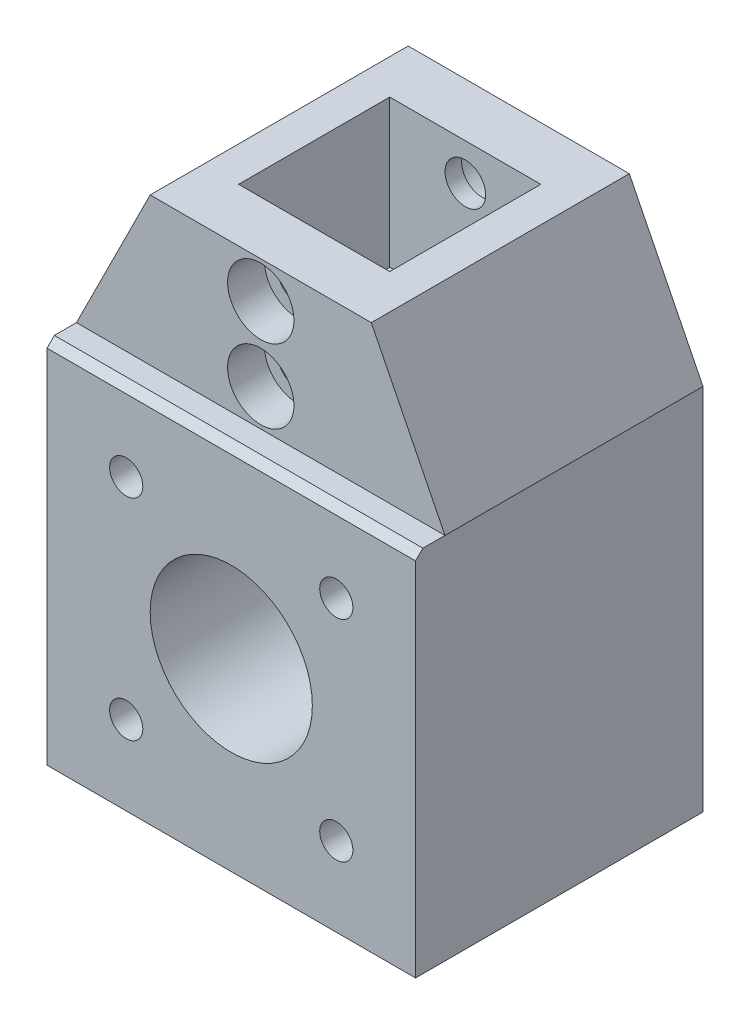
ISO-10303-21;
HEADER;
FILE_DESCRIPTION(('STEP AP214'),'2;1');
FILE_NAME('part.step','',(''),(''),'','','');
FILE_SCHEMA(('AUTOMOTIVE_DESIGN { 1 0 10303 214 1 1 1 1 }'));
ENDSEC;
DATA;
#1=APPLICATION_CONTEXT('core data for automotive mechanical design processes');
#2=APPLICATION_PROTOCOL_DEFINITION('international standard','automotive_design',2000,#1);
#3=PRODUCT_CONTEXT('',#1,'mechanical');
#4=PRODUCT('Part','Part','',(#3));
#5=PRODUCT_RELATED_PRODUCT_CATEGORY('part','',(#4));
#6=PRODUCT_DEFINITION_FORMATION('','',#4);
#7=PRODUCT_DEFINITION_CONTEXT('part definition',#1,'design');
#8=PRODUCT_DEFINITION('design','',#6,#7);
#9=PRODUCT_DEFINITION_SHAPE('','',#8);
#10=(LENGTH_UNIT() NAMED_UNIT(*) SI_UNIT(.MILLI.,.METRE.));
#11=(NAMED_UNIT(*) PLANE_ANGLE_UNIT() SI_UNIT($,.RADIAN.));
#12=(NAMED_UNIT(*) SI_UNIT($,.STERADIAN.) SOLID_ANGLE_UNIT());
#13=UNCERTAINTY_MEASURE_WITH_UNIT(LENGTH_MEASURE(1.E-05),#10,'distance_accuracy_value','');
#14=(GEOMETRIC_REPRESENTATION_CONTEXT(3) GLOBAL_UNCERTAINTY_ASSIGNED_CONTEXT((#13)) GLOBAL_UNIT_ASSIGNED_CONTEXT((#10,
#11,#12)) REPRESENTATION_CONTEXT('',''));
#15=CARTESIAN_POINT('',(0.,0.,0.));
#16=DIRECTION('',(0.,0.,1.));
#17=DIRECTION('',(1.,0.,0.));
#18=AXIS2_PLACEMENT_3D('',#15,#16,#17);
#19=CARTESIAN_POINT('',(14.25,-14.25,-17.5));
#20=DIRECTION('',(0.,0.,-1.));
#21=DIRECTION('',(-1.,0.,0.));
#22=AXIS2_PLACEMENT_3D('',#19,#20,#21);
#23=CYLINDRICAL_SURFACE('',#22,2.24999999999999);
#24=CARTESIAN_POINT('',(14.25,-14.25,21.5));
#25=DIRECTION('',(0.,0.,1.));
#26=DIRECTION('',(1.,0.,0.));
#27=AXIS2_PLACEMENT_3D('',#24,#25,#26);
#28=CIRCLE('',#27,2.25);
#29=CARTESIAN_POINT('',(16.5,-14.25,21.5));
#30=VERTEX_POINT('',#29);
#31=EDGE_CURVE('E308',#30,#30,#28,.T.);
#32=ORIENTED_EDGE('',*,*,#31,.T.);
#33=EDGE_LOOP('',(#32));
#34=FACE_BOUND('',#33,.T.);
#35=CARTESIAN_POINT('',(14.25,-14.25,-13.5));
#36=DIRECTION('',(0.,0.,-1.));
#37=DIRECTION('',(-1.,0.,0.));
#38=AXIS2_PLACEMENT_3D('',#35,#36,#37);
#39=CIRCLE('',#38,2.24999999999999);
#40=CARTESIAN_POINT('',(12.,-14.25,-13.5));
#41=VERTEX_POINT('',#40);
#42=EDGE_CURVE('E261',#41,#41,#39,.F.);
#43=ORIENTED_EDGE('',*,*,#42,.F.);
#44=EDGE_LOOP('',(#43));
#45=FACE_BOUND('',#44,.T.);
#46=ADVANCED_FACE('F35',(#34,#45),#23,.F.);
#47=CARTESIAN_POINT('',(-14.25,14.25,-17.5));
#48=DIRECTION('',(0.,0.,-1.));
#49=DIRECTION('',(-1.,0.,0.));
#50=AXIS2_PLACEMENT_3D('',#47,#48,#49);
#51=CYLINDRICAL_SURFACE('',#50,2.25);
#52=CARTESIAN_POINT('',(-14.25,14.25,21.5));
#53=DIRECTION('',(0.,0.,1.));
#54=DIRECTION('',(1.,0.,0.));
#55=AXIS2_PLACEMENT_3D('',#52,#53,#54);
#56=CIRCLE('',#55,2.24999999999999);
#57=CARTESIAN_POINT('',(-12.,14.25,21.5));
#58=VERTEX_POINT('',#57);
#59=EDGE_CURVE('E291',#58,#58,#56,.T.);
#60=ORIENTED_EDGE('',*,*,#59,.T.);
#61=EDGE_LOOP('',(#60));
#62=FACE_BOUND('',#61,.T.);
#63=CARTESIAN_POINT('',(-14.25,14.25,-13.5));
#64=DIRECTION('',(0.,0.,-1.));
#65=DIRECTION('',(-1.,0.,0.));
#66=AXIS2_PLACEMENT_3D('',#63,#64,#65);
#67=CIRCLE('',#66,2.25);
#68=CARTESIAN_POINT('',(-16.5,14.25,-13.5));
#69=VERTEX_POINT('',#68);
#70=EDGE_CURVE('E258',#69,#69,#67,.F.);
#71=ORIENTED_EDGE('',*,*,#70,.F.);
#72=EDGE_LOOP('',(#71));
#73=FACE_BOUND('',#72,.T.);
#74=ADVANCED_FACE('F325',(#62,#73),#51,.F.);
#75=CARTESIAN_POINT('',(-14.25,-14.25,-17.5));
#76=DIRECTION('',(0.,0.,-1.));
#77=DIRECTION('',(-1.,0.,0.));
#78=AXIS2_PLACEMENT_3D('',#75,#76,#77);
#79=CYLINDRICAL_SURFACE('',#78,2.25);
#80=CARTESIAN_POINT('',(-14.25,-14.25,21.5));
#81=DIRECTION('',(0.,0.,1.));
#82=DIRECTION('',(1.,0.,0.));
#83=AXIS2_PLACEMENT_3D('',#80,#81,#82);
#84=CIRCLE('',#83,2.24999999999999);
#85=CARTESIAN_POINT('',(-12.,-14.25,21.5));
#86=VERTEX_POINT('',#85);
#87=EDGE_CURVE('E154',#86,#86,#84,.T.);
#88=ORIENTED_EDGE('',*,*,#87,.T.);
#89=EDGE_LOOP('',(#88));
#90=FACE_BOUND('',#89,.T.);
#91=CARTESIAN_POINT('',(-14.25,-14.25,-13.5));
#92=DIRECTION('',(0.,0.,-1.));
#93=DIRECTION('',(-1.,0.,0.));
#94=AXIS2_PLACEMENT_3D('',#91,#92,#93);
#95=CIRCLE('',#94,2.25);
#96=CARTESIAN_POINT('',(-16.5,-14.25,-13.5));
#97=VERTEX_POINT('',#96);
#98=EDGE_CURVE('E254',#97,#97,#95,.F.);
#99=ORIENTED_EDGE('',*,*,#98,.F.);
#100=EDGE_LOOP('',(#99));
#101=FACE_BOUND('',#100,.T.);
#102=ADVANCED_FACE('F313',(#90,#101),#79,.F.);
#103=CARTESIAN_POINT('',(14.25,14.25,-17.5));
#104=DIRECTION('',(0.,0.,-1.));
#105=DIRECTION('',(-1.,0.,0.));
#106=AXIS2_PLACEMENT_3D('',#103,#104,#105);
#107=CYLINDRICAL_SURFACE('',#106,2.25);
#108=CARTESIAN_POINT('',(14.25,14.25,21.5));
#109=DIRECTION('',(0.,0.,1.));
#110=DIRECTION('',(1.,0.,0.));
#111=AXIS2_PLACEMENT_3D('',#108,#109,#110);
#112=CIRCLE('',#111,2.24999999999999);
#113=CARTESIAN_POINT('',(16.5,14.25,21.5));
#114=VERTEX_POINT('',#113);
#115=EDGE_CURVE('E305',#114,#114,#112,.T.);
#116=ORIENTED_EDGE('',*,*,#115,.T.);
#117=EDGE_LOOP('',(#116));
#118=FACE_BOUND('',#117,.T.);
#119=CARTESIAN_POINT('',(14.25,14.25,-13.5));
#120=DIRECTION('',(0.,0.,-1.));
#121=DIRECTION('',(-1.,0.,0.));
#122=AXIS2_PLACEMENT_3D('',#119,#120,#121);
#123=CIRCLE('',#122,2.25);
#124=CARTESIAN_POINT('',(12.,14.25,-13.5));
#125=VERTEX_POINT('',#124);
#126=EDGE_CURVE('E251',#125,#125,#123,.F.);
#127=ORIENTED_EDGE('',*,*,#126,.F.);
#128=EDGE_LOOP('',(#127));
#129=FACE_BOUND('',#128,.T.);
#130=ADVANCED_FACE('F505',(#118,#129),#107,.F.);
#131=CARTESIAN_POINT('',(0.,30.,-17.5));
#132=DIRECTION('',(0.,0.,-1.));
#133=DIRECTION('',(-1.,0.,0.));
#134=AXIS2_PLACEMENT_3D('',#131,#132,#133);
#135=CYLINDRICAL_SURFACE('',#134,2.74999999999999);
#136=CARTESIAN_POINT('',(0.,30.,10.25));
#137=DIRECTION('',(0.,0.,1.));
#138=DIRECTION('',(1.,0.,0.));
#139=AXIS2_PLACEMENT_3D('',#136,#137,#138);
#140=CIRCLE('',#139,2.74999999999999);
#141=CARTESIAN_POINT('',(2.74999999999999,30.,10.25));
#142=VERTEX_POINT('',#141);
#143=EDGE_CURVE('E162',#142,#142,#140,.T.);
#144=ORIENTED_EDGE('',*,*,#143,.F.);
#145=EDGE_LOOP('',(#144));
#146=FACE_BOUND('',#145,.T.);
#147=CARTESIAN_POINT('',(0.,30.,12.5));
#148=DIRECTION('',(0.,0.,1.));
#149=DIRECTION('',(1.,0.,0.));
#150=AXIS2_PLACEMENT_3D('',#147,#148,#149);
#151=CIRCLE('',#150,2.74999999999999);
#152=CARTESIAN_POINT('',(2.74999999999999,30.,12.5));
#153=VERTEX_POINT('',#152);
#154=EDGE_CURVE('E246',#153,#153,#151,.F.);
#155=ORIENTED_EDGE('',*,*,#154,.F.);
#156=EDGE_LOOP('',(#155));
#157=FACE_BOUND('',#156,.T.);
#158=ADVANCED_FACE('F510',(#146,#157),#135,.F.);
#159=CARTESIAN_POINT('',(0.,40.,-17.5));
#160=DIRECTION('',(0.,0.,-1.));
#161=DIRECTION('',(-1.,0.,0.));
#162=AXIS2_PLACEMENT_3D('',#159,#160,#161);
#163=CYLINDRICAL_SURFACE('',#162,2.74999999999999);
#164=CARTESIAN_POINT('',(0.,40.,10.25));
#165=DIRECTION('',(0.,0.,1.));
#166=DIRECTION('',(1.,0.,0.));
#167=AXIS2_PLACEMENT_3D('',#164,#165,#166);
#168=CIRCLE('',#167,2.74999999999999);
#169=CARTESIAN_POINT('',(2.74999999999999,40.,10.25));
#170=VERTEX_POINT('',#169);
#171=EDGE_CURVE('E159',#170,#170,#168,.T.);
#172=ORIENTED_EDGE('',*,*,#171,.F.);
#173=EDGE_LOOP('',(#172));
#174=FACE_BOUND('',#173,.T.);
#175=CARTESIAN_POINT('',(0.,40.,12.5));
#176=DIRECTION('',(0.,0.,1.));
#177=DIRECTION('',(1.,0.,0.));
#178=AXIS2_PLACEMENT_3D('',#175,#176,#177);
#179=CIRCLE('',#178,2.74999999999999);
#180=CARTESIAN_POINT('',(2.74999999999999,40.,12.5));
#181=VERTEX_POINT('',#180);
#182=EDGE_CURVE('E243',#181,#181,#179,.F.);
#183=ORIENTED_EDGE('',*,*,#182,.F.);
#184=EDGE_LOOP('',(#183));
#185=FACE_BOUND('',#184,.T.);
#186=ADVANCED_FACE('F586',(#174,#185),#163,.F.);
#187=CARTESIAN_POINT('',(0.,30.,-10.25));
#188=DIRECTION('',(0.,0.,-1.));
#189=DIRECTION('',(-1.,0.,0.));
#190=AXIS2_PLACEMENT_3D('',#187,#188,#189);
#191=CIRCLE('',#190,2.74999999999999);
#192=CARTESIAN_POINT('',(-2.74999999999999,30.,-10.25));
#193=VERTEX_POINT('',#192);
#194=EDGE_CURVE('E163',#193,#193,#191,.T.);
#195=ORIENTED_EDGE('',*,*,#194,.F.);
#196=EDGE_LOOP('',(#195));
#197=FACE_BOUND('',#196,.T.);
#198=CARTESIAN_POINT('',(0.,30.,-12.5));
#199=DIRECTION('',(0.,0.,-1.));
#200=DIRECTION('',(-1.,0.,0.));
#201=AXIS2_PLACEMENT_3D('',#198,#199,#200);
#202=CIRCLE('',#201,2.74999999999999);
#203=CARTESIAN_POINT('',(-2.74999999999999,30.,-12.5));
#204=VERTEX_POINT('',#203);
#205=EDGE_CURVE('E238',#204,#204,#202,.F.);
#206=ORIENTED_EDGE('',*,*,#205,.F.);
#207=EDGE_LOOP('',(#206));
#208=FACE_BOUND('',#207,.T.);
#209=ADVANCED_FACE('F591',(#197,#208),#135,.F.);
#210=CARTESIAN_POINT('',(0.,40.,-10.25));
#211=DIRECTION('',(0.,0.,-1.));
#212=DIRECTION('',(-1.,0.,0.));
#213=AXIS2_PLACEMENT_3D('',#210,#211,#212);
#214=CIRCLE('',#213,2.74999999999999);
#215=CARTESIAN_POINT('',(-2.74999999999999,40.,-10.25));
#216=VERTEX_POINT('',#215);
#217=EDGE_CURVE('E158',#216,#216,#214,.T.);
#218=ORIENTED_EDGE('',*,*,#217,.F.);
#219=EDGE_LOOP('',(#218));
#220=FACE_BOUND('',#219,.T.);
#221=CARTESIAN_POINT('',(0.,40.,-12.5));
#222=DIRECTION('',(0.,0.,-1.));
#223=DIRECTION('',(-1.,0.,0.));
#224=AXIS2_PLACEMENT_3D('',#221,#222,#223);
#225=CIRCLE('',#224,2.74999999999999);
#226=CARTESIAN_POINT('',(-2.74999999999999,40.,-12.5));
#227=VERTEX_POINT('',#226);
#228=EDGE_CURVE('E235',#227,#227,#225,.F.);
#229=ORIENTED_EDGE('',*,*,#228,.F.);
#230=EDGE_LOOP('',(#229));
#231=FACE_BOUND('',#230,.T.);
#232=ADVANCED_FACE('F384',(#220,#231),#163,.F.);
#233=CARTESIAN_POINT('',(0.,0.,17.5));
#234=DIRECTION('',(0.,0.,-1.));
#235=DIRECTION('',(-1.,0.,0.));
#236=AXIS2_PLACEMENT_3D('',#233,#234,#235);
#237=PLANE('',#236);
#238=CARTESIAN_POINT('',(0.,40.,17.5));
#239=DIRECTION('',(0.,0.,-1.));
#240=DIRECTION('',(-1.,0.,0.));
#241=AXIS2_PLACEMENT_3D('',#238,#239,#240);
#242=CIRCLE('',#241,4.5);
#243=CARTESIAN_POINT('',(-4.5,40.,17.5));
#244=VERTEX_POINT('',#243);
#245=EDGE_CURVE('E274',#244,#244,#242,.T.);
#246=ORIENTED_EDGE('',*,*,#245,.T.);
#247=EDGE_LOOP('',(#246));
#248=FACE_BOUND('',#247,.T.);
#249=CARTESIAN_POINT('',(0.,30.,17.5));
#250=DIRECTION('',(0.,0.,-1.));
#251=DIRECTION('',(-1.,0.,0.));
#252=AXIS2_PLACEMENT_3D('',#249,#250,#251);
#253=CIRCLE('',#252,4.5);
#254=CARTESIAN_POINT('',(-4.5,30.,17.5));
#255=VERTEX_POINT('',#254);
#256=EDGE_CURVE('E264',#255,#255,#253,.T.);
#257=ORIENTED_EDGE('',*,*,#256,.T.);
#258=EDGE_LOOP('',(#257));
#259=FACE_BOUND('',#258,.T.);
#260=DIRECTION('',(-1.,0.,0.));
#261=VECTOR('',#260,1.);
#262=CARTESIAN_POINT('',(25.,25.,17.5));
#263=LINE('',#262,#261);
#264=CARTESIAN_POINT('',(25.,25.,17.5));
#265=VERTEX_POINT('',#264);
#266=CARTESIAN_POINT('',(-25.,25.,17.5));
#267=VERTEX_POINT('',#266);
#268=EDGE_CURVE('E132',#265,#267,#263,.T.);
#269=ORIENTED_EDGE('',*,*,#268,.F.);
#270=DIRECTION('',(-0.447213595499958,0.894427190999916,0.));
#271=VECTOR('',#270,1.);
#272=CARTESIAN_POINT('',(15.,45.,17.5));
#273=LINE('',#272,#271);
#274=CARTESIAN_POINT('',(15.,45.,17.5));
#275=VERTEX_POINT('',#274);
#276=EDGE_CURVE('E201',#265,#275,#273,.T.);
#277=ORIENTED_EDGE('',*,*,#276,.T.);
#278=DIRECTION('',(-1.,0.,0.));
#279=VECTOR('',#278,1.);
#280=CARTESIAN_POINT('',(-15.,45.,17.5));
#281=LINE('',#280,#279);
#282=CARTESIAN_POINT('',(-15.,45.,17.5));
#283=VERTEX_POINT('',#282);
#284=EDGE_CURVE('E203',#275,#283,#281,.T.);
#285=ORIENTED_EDGE('',*,*,#284,.T.);
#286=DIRECTION('',(-0.447213595499958,-0.894427190999916,0.));
#287=VECTOR('',#286,1.);
#288=CARTESIAN_POINT('',(-25.,25.,17.5));
#289=LINE('',#288,#287);
#290=EDGE_CURVE('E206',#283,#267,#289,.T.);
#291=ORIENTED_EDGE('',*,*,#290,.T.);
#292=EDGE_LOOP('',(#269,#277,#285,#291));
#293=FACE_BOUND('',#292,.T.);
#294=ADVANCED_FACE('F380',(#248,#259,#293),#237,.F.);
#295=CARTESIAN_POINT('',(0.,0.,-17.5));
#296=DIRECTION('',(0.,0.,-1.));
#297=DIRECTION('',(-1.,0.,0.));
#298=AXIS2_PLACEMENT_3D('',#295,#296,#297);
#299=PLANE('',#298);
#300=CARTESIAN_POINT('',(14.25,-14.25,-17.5));
#301=DIRECTION('',(0.,0.,-1.));
#302=DIRECTION('',(-1.,0.,0.));
#303=AXIS2_PLACEMENT_3D('',#300,#301,#302);
#304=CIRCLE('',#303,3.75);
#305=CARTESIAN_POINT('',(10.5,-14.25,-17.5));
#306=VERTEX_POINT('',#305);
#307=EDGE_CURVE('E849',#306,#306,#304,.T.);
#308=ORIENTED_EDGE('',*,*,#307,.F.);
#309=EDGE_LOOP('',(#308));
#310=FACE_BOUND('',#309,.T.);
#311=CARTESIAN_POINT('',(-14.25,-14.25,-17.5));
#312=DIRECTION('',(0.,0.,-1.));
#313=DIRECTION('',(-1.,0.,0.));
#314=AXIS2_PLACEMENT_3D('',#311,#312,#313);
#315=CIRCLE('',#314,3.75);
#316=CARTESIAN_POINT('',(-18.,-14.25,-17.5));
#317=VERTEX_POINT('',#316);
#318=EDGE_CURVE('E855',#317,#317,#315,.T.);
#319=ORIENTED_EDGE('',*,*,#318,.F.);
#320=EDGE_LOOP('',(#319));
#321=FACE_BOUND('',#320,.T.);
#322=CARTESIAN_POINT('',(-14.25,14.25,-17.5));
#323=DIRECTION('',(0.,0.,-1.));
#324=DIRECTION('',(-1.,0.,0.));
#325=AXIS2_PLACEMENT_3D('',#322,#323,#324);
#326=CIRCLE('',#325,3.75);
#327=CARTESIAN_POINT('',(-18.,14.25,-17.5));
#328=VERTEX_POINT('',#327);
#329=EDGE_CURVE('E861',#328,#328,#326,.T.);
#330=ORIENTED_EDGE('',*,*,#329,.F.);
#331=EDGE_LOOP('',(#330));
#332=FACE_BOUND('',#331,.T.);
#333=CARTESIAN_POINT('',(14.25,14.25,-17.5));
#334=DIRECTION('',(0.,0.,-1.));
#335=DIRECTION('',(-1.,0.,0.));
#336=AXIS2_PLACEMENT_3D('',#333,#334,#335);
#337=CIRCLE('',#336,3.75);
#338=CARTESIAN_POINT('',(10.5,14.25,-17.5));
#339=VERTEX_POINT('',#338);
#340=EDGE_CURVE('E843',#339,#339,#337,.T.);
#341=ORIENTED_EDGE('',*,*,#340,.F.);
#342=EDGE_LOOP('',(#341));
#343=FACE_BOUND('',#342,.T.);
#344=CARTESIAN_POINT('',(0.,40.,-17.5));
#345=DIRECTION('',(0.,0.,-1.));
#346=DIRECTION('',(-1.,0.,0.));
#347=AXIS2_PLACEMENT_3D('',#344,#345,#346);
#348=CIRCLE('',#347,4.5);
#349=CARTESIAN_POINT('',(-4.5,40.,-17.5));
#350=VERTEX_POINT('',#349);
#351=EDGE_CURVE('E280',#350,#350,#348,.T.);
#352=ORIENTED_EDGE('',*,*,#351,.F.);
#353=EDGE_LOOP('',(#352));
#354=FACE_BOUND('',#353,.T.);
#355=CARTESIAN_POINT('',(0.,30.,-17.5));
#356=DIRECTION('',(0.,0.,-1.));
#357=DIRECTION('',(-1.,0.,0.));
#358=AXIS2_PLACEMENT_3D('',#355,#356,#357);
#359=CIRCLE('',#358,4.5);
#360=CARTESIAN_POINT('',(-4.5,30.,-17.5));
#361=VERTEX_POINT('',#360);
#362=EDGE_CURVE('E250',#361,#361,#359,.T.);
#363=ORIENTED_EDGE('',*,*,#362,.F.);
#364=EDGE_LOOP('',(#363));
#365=FACE_BOUND('',#364,.T.);
#366=CARTESIAN_POINT('',(18.,0.,-17.5));
#367=DIRECTION('',(0.,0.,-1.));
#368=DIRECTION('',(-1.,0.,0.));
#369=AXIS2_PLACEMENT_3D('',#366,#367,#368);
#370=CIRCLE('',#369,3.2);
#371=CARTESIAN_POINT('',(14.8,0.,-17.5));
#372=VERTEX_POINT('',#371);
#373=EDGE_CURVE('E292',#372,#372,#370,.T.);
#374=ORIENTED_EDGE('',*,*,#373,.F.);
#375=EDGE_LOOP('',(#374));
#376=FACE_BOUND('',#375,.T.);
#377=CARTESIAN_POINT('',(-18.,0.,-17.5));
#378=DIRECTION('',(0.,0.,-1.));
#379=DIRECTION('',(1.,0.,0.));
#380=AXIS2_PLACEMENT_3D('',#377,#378,#379);
#381=CIRCLE('',#380,3.2);
#382=CARTESIAN_POINT('',(-14.8,0.,-17.5));
#383=VERTEX_POINT('',#382);
#384=EDGE_CURVE('E242',#383,#383,#381,.T.);
#385=ORIENTED_EDGE('',*,*,#384,.F.);
#386=EDGE_LOOP('',(#385));
#387=FACE_BOUND('',#386,.T.);
#388=DIRECTION('',(0.,-1.,0.));
#389=VECTOR('',#388,1.);
#390=CARTESIAN_POINT('',(-25.,-25.,-17.5));
#391=LINE('',#390,#389);
#392=CARTESIAN_POINT('',(-25.,25.,-17.5));
#393=VERTEX_POINT('',#392);
#394=CARTESIAN_POINT('',(-25.,-25.,-17.5));
#395=VERTEX_POINT('',#394);
#396=EDGE_CURVE('E140',#393,#395,#391,.T.);
#397=ORIENTED_EDGE('',*,*,#396,.F.);
#398=DIRECTION('',(-0.447213595499958,-0.894427190999916,0.));
#399=VECTOR('',#398,1.);
#400=CARTESIAN_POINT('',(-25.,25.,-17.5));
#401=LINE('',#400,#399);
#402=CARTESIAN_POINT('',(-15.,45.,-17.5));
#403=VERTEX_POINT('',#402);
#404=EDGE_CURVE('E204',#403,#393,#401,.T.);
#405=ORIENTED_EDGE('',*,*,#404,.F.);
#406=DIRECTION('',(-1.,0.,0.));
#407=VECTOR('',#406,1.);
#408=CARTESIAN_POINT('',(-15.,45.,-17.5));
#409=LINE('',#408,#407);
#410=CARTESIAN_POINT('',(15.,45.,-17.5));
#411=VERTEX_POINT('',#410);
#412=EDGE_CURVE('E217',#411,#403,#409,.T.);
#413=ORIENTED_EDGE('',*,*,#412,.F.);
#414=DIRECTION('',(-0.447213595499958,0.894427190999916,0.));
#415=VECTOR('',#414,1.);
#416=CARTESIAN_POINT('',(15.,45.,-17.5));
#417=LINE('',#416,#415);
#418=CARTESIAN_POINT('',(25.,25.,-17.5));
#419=VERTEX_POINT('',#418);
#420=EDGE_CURVE('E215',#419,#411,#417,.T.);
#421=ORIENTED_EDGE('',*,*,#420,.F.);
#422=DIRECTION('',(0.,1.,0.));
#423=VECTOR('',#422,1.);
#424=CARTESIAN_POINT('',(25.,-25.,-17.5));
#425=LINE('',#424,#423);
#426=CARTESIAN_POINT('',(25.,-25.,-17.5));
#427=VERTEX_POINT('',#426);
#428=EDGE_CURVE('E213',#427,#419,#425,.T.);
#429=ORIENTED_EDGE('',*,*,#428,.F.);
#430=DIRECTION('',(1.,0.,0.));
#431=VECTOR('',#430,1.);
#432=CARTESIAN_POINT('',(25.,-25.,-17.5));
#433=LINE('',#432,#431);
#434=EDGE_CURVE('E211',#395,#427,#433,.T.);
#435=ORIENTED_EDGE('',*,*,#434,.F.);
#436=EDGE_LOOP('',(#397,#405,#413,#421,#429,#435));
#437=FACE_BOUND('',#436,.T.);
#438=CARTESIAN_POINT('',(0.,0.,-17.5));
#439=DIRECTION('',(0.,0.,1.));
#440=DIRECTION('',(1.,0.,0.));
#441=AXIS2_PLACEMENT_3D('',#438,#439,#440);
#442=CIRCLE('',#441,11.);
#443=CARTESIAN_POINT('',(11.,0.,-17.5));
#444=VERTEX_POINT('',#443);
#445=EDGE_CURVE('E192',#444,#444,#442,.T.);
#446=ORIENTED_EDGE('',*,*,#445,.T.);
#447=EDGE_LOOP('',(#446));
#448=FACE_BOUND('',#447,.T.);
#449=ADVANCED_FACE('F383',(#310,#321,#332,#343,#354,#365,#376,#387,#437,#448),#299,.T.);
#450=CARTESIAN_POINT('',(-25.,-25.,17.5));
#451=DIRECTION('',(1.,0.,0.));
#452=DIRECTION('',(0.,0.,-1.));
#453=AXIS2_PLACEMENT_3D('',#450,#451,#452);
#454=PLANE('',#453);
#455=DIRECTION('',(0.,-1.,0.));
#456=VECTOR('',#455,1.);
#457=CARTESIAN_POINT('',(-25.,-25.,21.5));
#458=LINE('',#457,#456);
#459=CARTESIAN_POINT('',(-25.,24.,21.5));
#460=VERTEX_POINT('',#459);
#461=CARTESIAN_POINT('',(-25.,-25.,21.5));
#462=VERTEX_POINT('',#461);
#463=EDGE_CURVE('E122',#460,#462,#458,.T.);
#464=ORIENTED_EDGE('',*,*,#463,.F.);
#465=DIRECTION('',(0.,0.707106781186548,-0.707106781186548));
#466=VECTOR('',#465,1.);
#467=CARTESIAN_POINT('',(-25.,24.,21.5));
#468=LINE('',#467,#466);
#469=CARTESIAN_POINT('',(-25.,25.,20.5));
#470=VERTEX_POINT('',#469);
#471=EDGE_CURVE('E57',#460,#470,#468,.T.);
#472=ORIENTED_EDGE('',*,*,#471,.T.);
#473=DIRECTION('',(0.,0.,-1.));
#474=VECTOR('',#473,1.);
#475=CARTESIAN_POINT('',(-25.,25.,21.5));
#476=LINE('',#475,#474);
#477=EDGE_CURVE('E148',#470,#267,#476,.T.);
#478=ORIENTED_EDGE('',*,*,#477,.T.);
#479=DIRECTION('',(0.,0.,-1.));
#480=VECTOR('',#479,1.);
#481=CARTESIAN_POINT('',(-25.,25.,17.5));
#482=LINE('',#481,#480);
#483=EDGE_CURVE('E209',#267,#393,#482,.T.);
#484=ORIENTED_EDGE('',*,*,#483,.T.);
#485=ORIENTED_EDGE('',*,*,#396,.T.);
#486=DIRECTION('',(0.,0.,-1.));
#487=VECTOR('',#486,1.);
#488=CARTESIAN_POINT('',(-25.,-25.,17.5));
#489=LINE('',#488,#487);
#490=EDGE_CURVE('E136',#462,#395,#489,.T.);
#491=ORIENTED_EDGE('',*,*,#490,.F.);
#492=EDGE_LOOP('',(#464,#472,#478,#484,#485,#491));
#493=FACE_BOUND('',#492,.T.);
#494=ADVANCED_FACE('F137',(#493),#454,.F.);
#495=CARTESIAN_POINT('',(25.,-25.,17.5));
#496=DIRECTION('',(0.,1.,0.));
#497=DIRECTION('',(0.,0.,1.));
#498=AXIS2_PLACEMENT_3D('',#495,#496,#497);
#499=PLANE('',#498);
#500=ORIENTED_EDGE('',*,*,#434,.T.);
#501=DIRECTION('',(0.,0.,-1.));
#502=VECTOR('',#501,1.);
#503=CARTESIAN_POINT('',(25.,-25.,17.5));
#504=LINE('',#503,#502);
#505=CARTESIAN_POINT('',(25.,-25.,21.5));
#506=VERTEX_POINT('',#505);
#507=EDGE_CURVE('E142',#506,#427,#504,.T.);
#508=ORIENTED_EDGE('',*,*,#507,.F.);
#509=DIRECTION('',(1.,0.,0.));
#510=VECTOR('',#509,1.);
#511=CARTESIAN_POINT('',(25.,-25.,21.5));
#512=LINE('',#511,#510);
#513=EDGE_CURVE('E128',#462,#506,#512,.T.);
#514=ORIENTED_EDGE('',*,*,#513,.F.);
#515=ORIENTED_EDGE('',*,*,#490,.T.);
#516=EDGE_LOOP('',(#500,#508,#514,#515));
#517=FACE_BOUND('',#516,.T.);
#518=ADVANCED_FACE('F144',(#517),#499,.F.);
#519=CARTESIAN_POINT('',(25.,-25.,17.5));
#520=DIRECTION('',(-1.,0.,0.));
#521=DIRECTION('',(0.,0.,1.));
#522=AXIS2_PLACEMENT_3D('',#519,#520,#521);
#523=PLANE('',#522);
#524=DIRECTION('',(0.,0.,-1.));
#525=VECTOR('',#524,1.);
#526=CARTESIAN_POINT('',(25.,25.,21.5));
#527=LINE('',#526,#525);
#528=CARTESIAN_POINT('',(25.,25.,20.5));
#529=VERTEX_POINT('',#528);
#530=EDGE_CURVE('E156',#529,#265,#527,.T.);
#531=ORIENTED_EDGE('',*,*,#530,.F.);
#532=DIRECTION('',(0.,-0.707106781186548,0.707106781186548));
#533=VECTOR('',#532,1.);
#534=CARTESIAN_POINT('',(25.,24.,21.5));
#535=LINE('',#534,#533);
#536=CARTESIAN_POINT('',(25.,24.,21.5));
#537=VERTEX_POINT('',#536);
#538=EDGE_CURVE('E11',#529,#537,#535,.T.);
#539=ORIENTED_EDGE('',*,*,#538,.T.);
#540=DIRECTION('',(0.,1.,0.));
#541=VECTOR('',#540,1.);
#542=CARTESIAN_POINT('',(25.,-25.,21.5));
#543=LINE('',#542,#541);
#544=EDGE_CURVE('E146',#506,#537,#543,.T.);
#545=ORIENTED_EDGE('',*,*,#544,.F.);
#546=ORIENTED_EDGE('',*,*,#507,.T.);
#547=ORIENTED_EDGE('',*,*,#428,.T.);
#548=DIRECTION('',(0.,0.,-1.));
#549=VECTOR('',#548,1.);
#550=CARTESIAN_POINT('',(25.,25.,17.5));
#551=LINE('',#550,#549);
#552=EDGE_CURVE('E227',#265,#419,#551,.T.);
#553=ORIENTED_EDGE('',*,*,#552,.F.);
#554=EDGE_LOOP('',(#531,#539,#545,#546,#547,#553));
#555=FACE_BOUND('',#554,.T.);
#556=ADVANCED_FACE('F399',(#555),#523,.F.);
#557=CARTESIAN_POINT('',(15.,45.,17.5));
#558=DIRECTION('',(-0.894427190999916,-0.447213595499959,0.));
#559=DIRECTION('',(0.447213595499959,-0.894427190999916,0.));
#560=AXIS2_PLACEMENT_3D('',#557,#558,#559);
#561=PLANE('',#560);
#562=ORIENTED_EDGE('',*,*,#420,.T.);
#563=DIRECTION('',(0.,0.,-1.));
#564=VECTOR('',#563,1.);
#565=CARTESIAN_POINT('',(15.,45.,17.5));
#566=LINE('',#565,#564);
#567=EDGE_CURVE('E224',#275,#411,#566,.T.);
#568=ORIENTED_EDGE('',*,*,#567,.F.);
#569=ORIENTED_EDGE('',*,*,#276,.F.);
#570=ORIENTED_EDGE('',*,*,#552,.T.);
#571=EDGE_LOOP('',(#562,#568,#569,#570));
#572=FACE_BOUND('',#571,.T.);
#573=ADVANCED_FACE('F395',(#572),#561,.F.);
#574=CARTESIAN_POINT('',(-15.,45.,17.5));
#575=DIRECTION('',(0.,-1.,0.));
#576=DIRECTION('',(0.,0.,-1.));
#577=AXIS2_PLACEMENT_3D('',#574,#575,#576);
#578=PLANE('',#577);
#579=DIRECTION('',(1.,0.,0.));
#580=VECTOR('',#579,1.);
#581=CARTESIAN_POINT('',(10.25,45.,10.25));
#582=LINE('',#581,#580);
#583=CARTESIAN_POINT('',(-10.25,45.,10.25));
#584=VERTEX_POINT('',#583);
#585=CARTESIAN_POINT('',(10.25,45.,10.25));
#586=VERTEX_POINT('',#585);
#587=EDGE_CURVE('E182',#584,#586,#582,.T.);
#588=ORIENTED_EDGE('',*,*,#587,.F.);
#589=DIRECTION('',(0.,0.,1.));
#590=VECTOR('',#589,1.);
#591=CARTESIAN_POINT('',(-10.25,45.,10.25));
#592=LINE('',#591,#590);
#593=CARTESIAN_POINT('',(-10.25,45.,-10.25));
#594=VERTEX_POINT('',#593);
#595=EDGE_CURVE('E166',#594,#584,#592,.T.);
#596=ORIENTED_EDGE('',*,*,#595,.F.);
#597=DIRECTION('',(-1.,0.,0.));
#598=VECTOR('',#597,1.);
#599=CARTESIAN_POINT('',(10.25,45.,-10.25));
#600=LINE('',#599,#598);
#601=CARTESIAN_POINT('',(10.25,45.,-10.25));
#602=VERTEX_POINT('',#601);
#603=EDGE_CURVE('E171',#602,#594,#600,.T.);
#604=ORIENTED_EDGE('',*,*,#603,.F.);
#605=DIRECTION('',(0.,0.,-1.));
#606=VECTOR('',#605,1.);
#607=CARTESIAN_POINT('',(10.25,45.,10.25));
#608=LINE('',#607,#606);
#609=EDGE_CURVE('E185',#586,#602,#608,.T.);
#610=ORIENTED_EDGE('',*,*,#609,.F.);
#611=EDGE_LOOP('',(#588,#596,#604,#610));
#612=FACE_BOUND('',#611,.T.);
#613=ORIENTED_EDGE('',*,*,#412,.T.);
#614=DIRECTION('',(0.,0.,-1.));
#615=VECTOR('',#614,1.);
#616=CARTESIAN_POINT('',(-15.,45.,17.5));
#617=LINE('',#616,#615);
#618=EDGE_CURVE('E221',#283,#403,#617,.T.);
#619=ORIENTED_EDGE('',*,*,#618,.F.);
#620=ORIENTED_EDGE('',*,*,#284,.F.);
#621=ORIENTED_EDGE('',*,*,#567,.T.);
#622=EDGE_LOOP('',(#613,#619,#620,#621));
#623=FACE_BOUND('',#622,.T.);
#624=ADVANCED_FACE('F391',(#612,#623),#578,.F.);
#625=CARTESIAN_POINT('',(-25.,25.,17.5));
#626=DIRECTION('',(0.894427190999916,-0.447213595499958,0.));
#627=DIRECTION('',(0.447213595499958,0.894427190999916,0.));
#628=AXIS2_PLACEMENT_3D('',#625,#626,#627);
#629=PLANE('',#628);
#630=ORIENTED_EDGE('',*,*,#404,.T.);
#631=ORIENTED_EDGE('',*,*,#483,.F.);
#632=ORIENTED_EDGE('',*,*,#290,.F.);
#633=ORIENTED_EDGE('',*,*,#618,.T.);
#634=EDGE_LOOP('',(#630,#631,#632,#633));
#635=FACE_BOUND('',#634,.T.);
#636=ADVANCED_FACE('F378',(#635),#629,.F.);
#637=CARTESIAN_POINT('',(0.,0.,17.5));
#638=DIRECTION('',(0.,0.,-1.));
#639=DIRECTION('',(-1.,0.,0.));
#640=AXIS2_PLACEMENT_3D('',#637,#638,#639);
#641=CYLINDRICAL_SURFACE('',#640,11.);
#642=ORIENTED_EDGE('',*,*,#445,.F.);
#643=EDGE_LOOP('',(#642));
#644=FACE_BOUND('',#643,.T.);
#645=CARTESIAN_POINT('',(0.,0.,21.5));
#646=DIRECTION('',(0.,0.,1.));
#647=DIRECTION('',(1.,0.,0.));
#648=AXIS2_PLACEMENT_3D('',#645,#646,#647);
#649=CIRCLE('',#648,11.);
#650=CARTESIAN_POINT('',(11.,0.,21.5));
#651=VERTEX_POINT('',#650);
#652=EDGE_CURVE('E302',#651,#651,#649,.T.);
#653=ORIENTED_EDGE('',*,*,#652,.T.);
#654=EDGE_LOOP('',(#653));
#655=FACE_BOUND('',#654,.T.);
#656=ADVANCED_FACE('F374',(#644,#655),#641,.F.);
#657=CARTESIAN_POINT('',(-10.25,25.,10.25));
#658=DIRECTION('',(-1.,0.,0.));
#659=DIRECTION('',(0.,0.,1.));
#660=AXIS2_PLACEMENT_3D('',#657,#658,#659);
#661=PLANE('',#660);
#662=ORIENTED_EDGE('',*,*,#595,.T.);
#663=DIRECTION('',(0.,1.,0.));
#664=VECTOR('',#663,1.);
#665=CARTESIAN_POINT('',(-10.25,25.,10.25));
#666=LINE('',#665,#664);
#667=CARTESIAN_POINT('',(-10.25,25.,10.25));
#668=VERTEX_POINT('',#667);
#669=EDGE_CURVE('E180',#668,#584,#666,.T.);
#670=ORIENTED_EDGE('',*,*,#669,.F.);
#671=DIRECTION('',(0.,0.,1.));
#672=VECTOR('',#671,1.);
#673=CARTESIAN_POINT('',(-10.25,25.,10.25));
#674=LINE('',#673,#672);
#675=CARTESIAN_POINT('',(-10.25,25.,-10.25));
#676=VERTEX_POINT('',#675);
#677=EDGE_CURVE('E167',#676,#668,#674,.T.);
#678=ORIENTED_EDGE('',*,*,#677,.F.);
#679=DIRECTION('',(0.,1.,0.));
#680=VECTOR('',#679,1.);
#681=CARTESIAN_POINT('',(-10.25,25.,-10.25));
#682=LINE('',#681,#680);
#683=EDGE_CURVE('E190',#676,#594,#682,.T.);
#684=ORIENTED_EDGE('',*,*,#683,.T.);
#685=EDGE_LOOP('',(#662,#670,#678,#684));
#686=FACE_BOUND('',#685,.T.);
#687=ADVANCED_FACE('F364',(#686),#661,.F.);
#688=CARTESIAN_POINT('',(10.25,25.,-10.25));
#689=DIRECTION('',(0.,0.,-1.));
#690=DIRECTION('',(-1.,0.,0.));
#691=AXIS2_PLACEMENT_3D('',#688,#689,#690);
#692=PLANE('',#691);
#693=ORIENTED_EDGE('',*,*,#217,.T.);
#694=EDGE_LOOP('',(#693));
#695=FACE_BOUND('',#694,.T.);
#696=ORIENTED_EDGE('',*,*,#194,.T.);
#697=EDGE_LOOP('',(#696));
#698=FACE_BOUND('',#697,.T.);
#699=ORIENTED_EDGE('',*,*,#603,.T.);
#700=ORIENTED_EDGE('',*,*,#683,.F.);
#701=DIRECTION('',(-1.,0.,0.));
#702=VECTOR('',#701,1.);
#703=CARTESIAN_POINT('',(10.25,25.,-10.25));
#704=LINE('',#703,#702);
#705=CARTESIAN_POINT('',(10.25,25.,-10.25));
#706=VERTEX_POINT('',#705);
#707=EDGE_CURVE('E177',#706,#676,#704,.T.);
#708=ORIENTED_EDGE('',*,*,#707,.F.);
#709=DIRECTION('',(0.,1.,0.));
#710=VECTOR('',#709,1.);
#711=CARTESIAN_POINT('',(10.25,25.,-10.25));
#712=LINE('',#711,#710);
#713=EDGE_CURVE('E193',#706,#602,#712,.T.);
#714=ORIENTED_EDGE('',*,*,#713,.T.);
#715=EDGE_LOOP('',(#699,#700,#708,#714));
#716=FACE_BOUND('',#715,.T.);
#717=ADVANCED_FACE('F360',(#695,#698,#716),#692,.F.);
#718=CARTESIAN_POINT('',(10.25,25.,10.25));
#719=DIRECTION('',(1.,0.,0.));
#720=DIRECTION('',(0.,0.,-1.));
#721=AXIS2_PLACEMENT_3D('',#718,#719,#720);
#722=PLANE('',#721);
#723=ORIENTED_EDGE('',*,*,#609,.T.);
#724=ORIENTED_EDGE('',*,*,#713,.F.);
#725=DIRECTION('',(0.,0.,-1.));
#726=VECTOR('',#725,1.);
#727=CARTESIAN_POINT('',(10.25,25.,10.25));
#728=LINE('',#727,#726);
#729=CARTESIAN_POINT('',(10.25,25.,10.25));
#730=VERTEX_POINT('',#729);
#731=EDGE_CURVE('E174',#730,#706,#728,.T.);
#732=ORIENTED_EDGE('',*,*,#731,.F.);
#733=DIRECTION('',(0.,1.,0.));
#734=VECTOR('',#733,1.);
#735=CARTESIAN_POINT('',(10.25,25.,10.25));
#736=LINE('',#735,#734);
#737=EDGE_CURVE('E195',#730,#586,#736,.T.);
#738=ORIENTED_EDGE('',*,*,#737,.T.);
#739=EDGE_LOOP('',(#723,#724,#732,#738));
#740=FACE_BOUND('',#739,.T.);
#741=ADVANCED_FACE('F363',(#740),#722,.F.);
#742=CARTESIAN_POINT('',(10.25,25.,10.25));
#743=DIRECTION('',(0.,0.,1.));
#744=DIRECTION('',(1.,0.,0.));
#745=AXIS2_PLACEMENT_3D('',#742,#743,#744);
#746=PLANE('',#745);
#747=ORIENTED_EDGE('',*,*,#171,.T.);
#748=EDGE_LOOP('',(#747));
#749=FACE_BOUND('',#748,.T.);
#750=ORIENTED_EDGE('',*,*,#143,.T.);
#751=EDGE_LOOP('',(#750));
#752=FACE_BOUND('',#751,.T.);
#753=ORIENTED_EDGE('',*,*,#587,.T.);
#754=ORIENTED_EDGE('',*,*,#737,.F.);
#755=DIRECTION('',(1.,0.,0.));
#756=VECTOR('',#755,1.);
#757=CARTESIAN_POINT('',(10.25,25.,10.25));
#758=LINE('',#757,#756);
#759=EDGE_CURVE('E170',#668,#730,#758,.T.);
#760=ORIENTED_EDGE('',*,*,#759,.F.);
#761=ORIENTED_EDGE('',*,*,#669,.T.);
#762=EDGE_LOOP('',(#753,#754,#760,#761));
#763=FACE_BOUND('',#762,.T.);
#764=ADVANCED_FACE('F358',(#749,#752,#763),#746,.F.);
#765=CARTESIAN_POINT('',(0.,25.,0.));
#766=DIRECTION('',(0.,1.,0.));
#767=DIRECTION('',(0.,0.,1.));
#768=AXIS2_PLACEMENT_3D('',#765,#766,#767);
#769=PLANE('',#768);
#770=ORIENTED_EDGE('',*,*,#677,.T.);
#771=ORIENTED_EDGE('',*,*,#759,.T.);
#772=ORIENTED_EDGE('',*,*,#731,.T.);
#773=ORIENTED_EDGE('',*,*,#707,.T.);
#774=EDGE_LOOP('',(#770,#771,#772,#773));
#775=FACE_BOUND('',#774,.T.);
#776=ADVANCED_FACE('F318',(#775),#769,.T.);
#777=CARTESIAN_POINT('',(0.,0.,21.5));
#778=DIRECTION('',(0.,0.,1.));
#779=DIRECTION('',(1.,0.,0.));
#780=AXIS2_PLACEMENT_3D('',#777,#778,#779);
#781=PLANE('',#780);
#782=ORIENTED_EDGE('',*,*,#652,.F.);
#783=EDGE_LOOP('',(#782));
#784=FACE_BOUND('',#783,.T.);
#785=ORIENTED_EDGE('',*,*,#31,.F.);
#786=EDGE_LOOP('',(#785));
#787=FACE_BOUND('',#786,.T.);
#788=ORIENTED_EDGE('',*,*,#544,.T.);
#789=DIRECTION('',(-1.,0.,0.));
#790=VECTOR('',#789,1.);
#791=CARTESIAN_POINT('',(-25.,24.,21.5));
#792=LINE('',#791,#790);
#793=EDGE_CURVE('E131',#537,#460,#792,.T.);
#794=ORIENTED_EDGE('',*,*,#793,.T.);
#795=ORIENTED_EDGE('',*,*,#463,.T.);
#796=ORIENTED_EDGE('',*,*,#513,.T.);
#797=EDGE_LOOP('',(#788,#794,#795,#796));
#798=FACE_BOUND('',#797,.T.);
#799=ORIENTED_EDGE('',*,*,#87,.F.);
#800=EDGE_LOOP('',(#799));
#801=FACE_BOUND('',#800,.T.);
#802=ORIENTED_EDGE('',*,*,#115,.F.);
#803=EDGE_LOOP('',(#802));
#804=FACE_BOUND('',#803,.T.);
#805=ORIENTED_EDGE('',*,*,#59,.F.);
#806=EDGE_LOOP('',(#805));
#807=FACE_BOUND('',#806,.T.);
#808=ADVANCED_FACE('F125',(#784,#787,#798,#801,#804,#807),#781,.T.);
#809=CARTESIAN_POINT('',(25.,25.,21.5));
#810=DIRECTION('',(0.,-1.,0.));
#811=DIRECTION('',(0.,0.,-1.));
#812=AXIS2_PLACEMENT_3D('',#809,#810,#811);
#813=PLANE('',#812);
#814=ORIENTED_EDGE('',*,*,#477,.F.);
#815=DIRECTION('',(1.,0.,0.));
#816=VECTOR('',#815,1.);
#817=CARTESIAN_POINT('',(25.,25.,20.5));
#818=LINE('',#817,#816);
#819=EDGE_CURVE('E43',#470,#529,#818,.T.);
#820=ORIENTED_EDGE('',*,*,#819,.T.);
#821=ORIENTED_EDGE('',*,*,#530,.T.);
#822=ORIENTED_EDGE('',*,*,#268,.T.);
#823=EDGE_LOOP('',(#814,#820,#821,#822));
#824=FACE_BOUND('',#823,.T.);
#825=ADVANCED_FACE('F317',(#824),#813,.F.);
#826=CARTESIAN_POINT('',(-18.,0.,-8.));
#827=DIRECTION('',(0.,0.,-1.));
#828=DIRECTION('',(-1.,0.,0.));
#829=AXIS2_PLACEMENT_3D('',#826,#827,#828);
#830=CYLINDRICAL_SURFACE('',#829,3.2);
#831=CARTESIAN_POINT('',(-18.,0.,-8.));
#832=DIRECTION('',(0.,0.,-1.));
#833=DIRECTION('',(1.,0.,0.));
#834=AXIS2_PLACEMENT_3D('',#831,#832,#833);
#835=CIRCLE('',#834,3.2);
#836=CARTESIAN_POINT('',(-14.8,0.,-8.));
#837=VERTEX_POINT('',#836);
#838=EDGE_CURVE('E295',#837,#837,#835,.T.);
#839=ORIENTED_EDGE('',*,*,#838,.F.);
#840=EDGE_LOOP('',(#839));
#841=FACE_BOUND('',#840,.T.);
#842=ORIENTED_EDGE('',*,*,#384,.T.);
#843=EDGE_LOOP('',(#842));
#844=FACE_BOUND('',#843,.T.);
#845=ADVANCED_FACE('F428',(#841,#844),#830,.F.);
#846=CARTESIAN_POINT('',(-18.,0.,-8.));
#847=DIRECTION('',(0.,0.,1.));
#848=DIRECTION('',(1.,0.,0.));
#849=AXIS2_PLACEMENT_3D('',#846,#847,#848);
#850=PLANE('',#849);
#851=ORIENTED_EDGE('',*,*,#838,.T.);
#852=EDGE_LOOP('',(#851));
#853=FACE_BOUND('',#852,.T.);
#854=ADVANCED_FACE('F672',(#853),#850,.F.);
#855=CARTESIAN_POINT('',(18.,0.,-8.));
#856=DIRECTION('',(0.,0.,-1.));
#857=DIRECTION('',(-1.,0.,0.));
#858=AXIS2_PLACEMENT_3D('',#855,#856,#857);
#859=CYLINDRICAL_SURFACE('',#858,3.2);
#860=CARTESIAN_POINT('',(18.,0.,-8.));
#861=DIRECTION('',(0.,0.,-1.));
#862=DIRECTION('',(-1.,0.,0.));
#863=AXIS2_PLACEMENT_3D('',#860,#861,#862);
#864=CIRCLE('',#863,3.2);
#865=CARTESIAN_POINT('',(14.8,0.,-8.));
#866=VERTEX_POINT('',#865);
#867=EDGE_CURVE('E288',#866,#866,#864,.T.);
#868=ORIENTED_EDGE('',*,*,#867,.F.);
#869=EDGE_LOOP('',(#868));
#870=FACE_BOUND('',#869,.T.);
#871=ORIENTED_EDGE('',*,*,#373,.T.);
#872=EDGE_LOOP('',(#871));
#873=FACE_BOUND('',#872,.T.);
#874=ADVANCED_FACE('F662',(#870,#873),#859,.F.);
#875=CARTESIAN_POINT('',(18.,0.,-8.));
#876=DIRECTION('',(0.,0.,-1.));
#877=DIRECTION('',(-1.,0.,0.));
#878=AXIS2_PLACEMENT_3D('',#875,#876,#877);
#879=PLANE('',#878);
#880=ORIENTED_EDGE('',*,*,#867,.T.);
#881=EDGE_LOOP('',(#880));
#882=FACE_BOUND('',#881,.T.);
#883=ADVANCED_FACE('F638',(#882),#879,.T.);
#884=CARTESIAN_POINT('',(0.,40.,-12.5));
#885=DIRECTION('',(0.,0.,-1.));
#886=DIRECTION('',(-1.,0.,0.));
#887=AXIS2_PLACEMENT_3D('',#884,#885,#886);
#888=PLANE('',#887);
#889=CARTESIAN_POINT('',(0.,40.,-12.5));
#890=DIRECTION('',(0.,0.,-1.));
#891=DIRECTION('',(-1.,0.,0.));
#892=AXIS2_PLACEMENT_3D('',#889,#890,#891);
#893=CIRCLE('',#892,4.5);
#894=CARTESIAN_POINT('',(-4.5,40.,-12.5));
#895=VERTEX_POINT('',#894);
#896=EDGE_CURVE('E239',#895,#895,#893,.T.);
#897=ORIENTED_EDGE('',*,*,#896,.T.);
#898=EDGE_LOOP('',(#897));
#899=FACE_BOUND('',#898,.T.);
#900=ORIENTED_EDGE('',*,*,#228,.T.);
#901=EDGE_LOOP('',(#900));
#902=FACE_BOUND('',#901,.T.);
#903=ADVANCED_FACE('F628',(#899,#902),#888,.T.);
#904=CARTESIAN_POINT('',(0.,40.,-12.5));
#905=DIRECTION('',(0.,0.,-1.));
#906=DIRECTION('',(-1.,0.,0.));
#907=AXIS2_PLACEMENT_3D('',#904,#905,#906);
#908=CYLINDRICAL_SURFACE('',#907,4.5);
#909=ORIENTED_EDGE('',*,*,#896,.F.);
#910=EDGE_LOOP('',(#909));
#911=FACE_BOUND('',#910,.T.);
#912=ORIENTED_EDGE('',*,*,#351,.T.);
#913=EDGE_LOOP('',(#912));
#914=FACE_BOUND('',#913,.T.);
#915=ADVANCED_FACE('F618',(#911,#914),#908,.F.);
#916=CARTESIAN_POINT('',(0.,30.,-12.5));
#917=DIRECTION('',(0.,0.,-1.));
#918=DIRECTION('',(-1.,0.,0.));
#919=AXIS2_PLACEMENT_3D('',#916,#917,#918);
#920=PLANE('',#919);
#921=CARTESIAN_POINT('',(0.,30.,-12.5));
#922=DIRECTION('',(0.,0.,-1.));
#923=DIRECTION('',(-1.,0.,0.));
#924=AXIS2_PLACEMENT_3D('',#921,#922,#923);
#925=CIRCLE('',#924,4.5);
#926=CARTESIAN_POINT('',(-4.5,30.,-12.5));
#927=VERTEX_POINT('',#926);
#928=EDGE_CURVE('E283',#927,#927,#925,.T.);
#929=ORIENTED_EDGE('',*,*,#928,.T.);
#930=EDGE_LOOP('',(#929));
#931=FACE_BOUND('',#930,.T.);
#932=ORIENTED_EDGE('',*,*,#205,.T.);
#933=EDGE_LOOP('',(#932));
#934=FACE_BOUND('',#933,.T.);
#935=ADVANCED_FACE('F608',(#931,#934),#920,.T.);
#936=CARTESIAN_POINT('',(0.,30.,-12.5));
#937=DIRECTION('',(0.,0.,-1.));
#938=DIRECTION('',(-1.,0.,0.));
#939=AXIS2_PLACEMENT_3D('',#936,#937,#938);
#940=CYLINDRICAL_SURFACE('',#939,4.5);
#941=ORIENTED_EDGE('',*,*,#928,.F.);
#942=EDGE_LOOP('',(#941));
#943=FACE_BOUND('',#942,.T.);
#944=ORIENTED_EDGE('',*,*,#362,.T.);
#945=EDGE_LOOP('',(#944));
#946=FACE_BOUND('',#945,.T.);
#947=ADVANCED_FACE('F570',(#943,#946),#940,.F.);
#948=CARTESIAN_POINT('',(0.,40.,12.5));
#949=DIRECTION('',(0.,0.,1.));
#950=DIRECTION('',(-1.,0.,0.));
#951=AXIS2_PLACEMENT_3D('',#948,#949,#950);
#952=PLANE('',#951);
#953=CARTESIAN_POINT('',(0.,40.,12.5));
#954=DIRECTION('',(0.,0.,-1.));
#955=DIRECTION('',(-1.,0.,0.));
#956=AXIS2_PLACEMENT_3D('',#953,#954,#955);
#957=CIRCLE('',#956,4.5);
#958=CARTESIAN_POINT('',(-4.5,40.,12.5));
#959=VERTEX_POINT('',#958);
#960=EDGE_CURVE('E247',#959,#959,#957,.T.);
#961=ORIENTED_EDGE('',*,*,#960,.F.);
#962=EDGE_LOOP('',(#961));
#963=FACE_BOUND('',#962,.T.);
#964=ORIENTED_EDGE('',*,*,#182,.T.);
#965=EDGE_LOOP('',(#964));
#966=FACE_BOUND('',#965,.T.);
#967=ADVANCED_FACE('F560',(#963,#966),#952,.T.);
#968=CARTESIAN_POINT('',(0.,40.,12.5));
#969=DIRECTION('',(0.,0.,1.));
#970=DIRECTION('',(1.,0.,0.));
#971=AXIS2_PLACEMENT_3D('',#968,#969,#970);
#972=CYLINDRICAL_SURFACE('',#971,4.5);
#973=ORIENTED_EDGE('',*,*,#960,.T.);
#974=EDGE_LOOP('',(#973));
#975=FACE_BOUND('',#974,.T.);
#976=ORIENTED_EDGE('',*,*,#245,.F.);
#977=EDGE_LOOP('',(#976));
#978=FACE_BOUND('',#977,.T.);
#979=ADVANCED_FACE('F550',(#975,#978),#972,.F.);
#980=CARTESIAN_POINT('',(0.,30.,12.5));
#981=DIRECTION('',(0.,0.,1.));
#982=DIRECTION('',(-1.,0.,0.));
#983=AXIS2_PLACEMENT_3D('',#980,#981,#982);
#984=PLANE('',#983);
#985=CARTESIAN_POINT('',(0.,30.,12.5));
#986=DIRECTION('',(0.,0.,-1.));
#987=DIRECTION('',(-1.,0.,0.));
#988=AXIS2_PLACEMENT_3D('',#985,#986,#987);
#989=CIRCLE('',#988,4.5);
#990=CARTESIAN_POINT('',(-4.5,30.,12.5));
#991=VERTEX_POINT('',#990);
#992=EDGE_CURVE('E269',#991,#991,#989,.T.);
#993=ORIENTED_EDGE('',*,*,#992,.F.);
#994=EDGE_LOOP('',(#993));
#995=FACE_BOUND('',#994,.T.);
#996=ORIENTED_EDGE('',*,*,#154,.T.);
#997=EDGE_LOOP('',(#996));
#998=FACE_BOUND('',#997,.T.);
#999=ADVANCED_FACE('F540',(#995,#998),#984,.T.);
#1000=CARTESIAN_POINT('',(0.,30.,12.5));
#1001=DIRECTION('',(0.,0.,1.));
#1002=DIRECTION('',(1.,0.,0.));
#1003=AXIS2_PLACEMENT_3D('',#1000,#1001,#1002);
#1004=CYLINDRICAL_SURFACE('',#1003,4.5);
#1005=ORIENTED_EDGE('',*,*,#992,.T.);
#1006=EDGE_LOOP('',(#1005));
#1007=FACE_BOUND('',#1006,.T.);
#1008=ORIENTED_EDGE('',*,*,#256,.F.);
#1009=EDGE_LOOP('',(#1008));
#1010=FACE_BOUND('',#1009,.T.);
#1011=ADVANCED_FACE('F490',(#1007,#1010),#1004,.F.);
#1012=CARTESIAN_POINT('',(14.25,14.25,-13.5));
#1013=DIRECTION('',(0.,0.,-1.));
#1014=DIRECTION('',(-1.,0.,0.));
#1015=AXIS2_PLACEMENT_3D('',#1012,#1013,#1014);
#1016=PLANE('',#1015);
#1017=CARTESIAN_POINT('',(14.25,14.25,-13.5));
#1018=DIRECTION('',(0.,0.,-1.));
#1019=DIRECTION('',(-1.,0.,0.));
#1020=AXIS2_PLACEMENT_3D('',#1017,#1018,#1019);
#1021=CIRCLE('',#1020,3.75);
#1022=CARTESIAN_POINT('',(10.5,14.25,-13.5));
#1023=VERTEX_POINT('',#1022);
#1024=EDGE_CURVE('E255',#1023,#1023,#1021,.T.);
#1025=ORIENTED_EDGE('',*,*,#1024,.T.);
#1026=EDGE_LOOP('',(#1025));
#1027=FACE_BOUND('',#1026,.T.);
#1028=ORIENTED_EDGE('',*,*,#126,.T.);
#1029=EDGE_LOOP('',(#1028));
#1030=FACE_BOUND('',#1029,.T.);
#1031=ADVANCED_FACE('F480',(#1027,#1030),#1016,.T.);
#1032=CARTESIAN_POINT('',(14.25,14.25,-13.5));
#1033=DIRECTION('',(0.,0.,-1.));
#1034=DIRECTION('',(-1.,0.,0.));
#1035=AXIS2_PLACEMENT_3D('',#1032,#1033,#1034);
#1036=CYLINDRICAL_SURFACE('',#1035,3.75);
#1037=ORIENTED_EDGE('',*,*,#1024,.F.);
#1038=EDGE_LOOP('',(#1037));
#1039=FACE_BOUND('',#1038,.T.);
#1040=ORIENTED_EDGE('',*,*,#340,.T.);
#1041=EDGE_LOOP('',(#1040));
#1042=FACE_BOUND('',#1041,.T.);
#1043=ADVANCED_FACE('F470',(#1039,#1042),#1036,.F.);
#1044=CARTESIAN_POINT('',(-14.25,-14.25,-13.5));
#1045=DIRECTION('',(0.,0.,-1.));
#1046=DIRECTION('',(-1.,0.,0.));
#1047=AXIS2_PLACEMENT_3D('',#1044,#1045,#1046);
#1048=PLANE('',#1047);
#1049=CARTESIAN_POINT('',(-14.25,-14.25,-13.5));
#1050=DIRECTION('',(0.,0.,-1.));
#1051=DIRECTION('',(-1.,0.,0.));
#1052=AXIS2_PLACEMENT_3D('',#1049,#1050,#1051);
#1053=CIRCLE('',#1052,3.75);
#1054=CARTESIAN_POINT('',(-18.,-14.25,-13.5));
#1055=VERTEX_POINT('',#1054);
#1056=EDGE_CURVE('E858',#1055,#1055,#1053,.T.);
#1057=ORIENTED_EDGE('',*,*,#1056,.T.);
#1058=EDGE_LOOP('',(#1057));
#1059=FACE_BOUND('',#1058,.T.);
#1060=ORIENTED_EDGE('',*,*,#98,.T.);
#1061=EDGE_LOOP('',(#1060));
#1062=FACE_BOUND('',#1061,.T.);
#1063=ADVANCED_FACE('F344',(#1059,#1062),#1048,.T.);
#1064=CARTESIAN_POINT('',(-14.25,-14.25,-13.5));
#1065=DIRECTION('',(0.,0.,-1.));
#1066=DIRECTION('',(-1.,0.,0.));
#1067=AXIS2_PLACEMENT_3D('',#1064,#1065,#1066);
#1068=CYLINDRICAL_SURFACE('',#1067,3.75);
#1069=ORIENTED_EDGE('',*,*,#1056,.F.);
#1070=EDGE_LOOP('',(#1069));
#1071=FACE_BOUND('',#1070,.T.);
#1072=ORIENTED_EDGE('',*,*,#318,.T.);
#1073=EDGE_LOOP('',(#1072));
#1074=FACE_BOUND('',#1073,.T.);
#1075=ADVANCED_FACE('F334',(#1071,#1074),#1068,.F.);
#1076=CARTESIAN_POINT('',(-14.25,14.25,-13.5));
#1077=DIRECTION('',(0.,0.,-1.));
#1078=DIRECTION('',(-1.,0.,0.));
#1079=AXIS2_PLACEMENT_3D('',#1076,#1077,#1078);
#1080=PLANE('',#1079);
#1081=CARTESIAN_POINT('',(-14.25,14.25,-13.5));
#1082=DIRECTION('',(0.,0.,-1.));
#1083=DIRECTION('',(-1.,0.,0.));
#1084=AXIS2_PLACEMENT_3D('',#1081,#1082,#1083);
#1085=CIRCLE('',#1084,3.75);
#1086=CARTESIAN_POINT('',(-18.,14.25,-13.5));
#1087=VERTEX_POINT('',#1086);
#1088=EDGE_CURVE('E846',#1087,#1087,#1085,.T.);
#1089=ORIENTED_EDGE('',*,*,#1088,.T.);
#1090=EDGE_LOOP('',(#1089));
#1091=FACE_BOUND('',#1090,.T.);
#1092=ORIENTED_EDGE('',*,*,#70,.T.);
#1093=EDGE_LOOP('',(#1092));
#1094=FACE_BOUND('',#1093,.T.);
#1095=ADVANCED_FACE('F331',(#1091,#1094),#1080,.T.);
#1096=CARTESIAN_POINT('',(-14.25,14.25,-13.5));
#1097=DIRECTION('',(0.,0.,-1.));
#1098=DIRECTION('',(-1.,0.,0.));
#1099=AXIS2_PLACEMENT_3D('',#1096,#1097,#1098);
#1100=CYLINDRICAL_SURFACE('',#1099,3.75);
#1101=ORIENTED_EDGE('',*,*,#1088,.F.);
#1102=EDGE_LOOP('',(#1101));
#1103=FACE_BOUND('',#1102,.T.);
#1104=ORIENTED_EDGE('',*,*,#329,.T.);
#1105=EDGE_LOOP('',(#1104));
#1106=FACE_BOUND('',#1105,.T.);
#1107=ADVANCED_FACE('F333',(#1103,#1106),#1100,.F.);
#1108=CARTESIAN_POINT('',(14.25,-14.25,-13.5));
#1109=DIRECTION('',(0.,0.,-1.));
#1110=DIRECTION('',(-1.,0.,0.));
#1111=AXIS2_PLACEMENT_3D('',#1108,#1109,#1110);
#1112=PLANE('',#1111);
#1113=CARTESIAN_POINT('',(14.25,-14.25,-13.5));
#1114=DIRECTION('',(0.,0.,-1.));
#1115=DIRECTION('',(-1.,0.,0.));
#1116=AXIS2_PLACEMENT_3D('',#1113,#1114,#1115);
#1117=CIRCLE('',#1116,3.75);
#1118=CARTESIAN_POINT('',(10.5,-14.25,-13.5));
#1119=VERTEX_POINT('',#1118);
#1120=EDGE_CURVE('E852',#1119,#1119,#1117,.T.);
#1121=ORIENTED_EDGE('',*,*,#1120,.T.);
#1122=EDGE_LOOP('',(#1121));
#1123=FACE_BOUND('',#1122,.T.);
#1124=ORIENTED_EDGE('',*,*,#42,.T.);
#1125=EDGE_LOOP('',(#1124));
#1126=FACE_BOUND('',#1125,.T.);
#1127=ADVANCED_FACE('F341',(#1123,#1126),#1112,.T.);
#1128=CARTESIAN_POINT('',(14.25,-14.25,-13.5));
#1129=DIRECTION('',(0.,0.,-1.));
#1130=DIRECTION('',(-1.,0.,0.));
#1131=AXIS2_PLACEMENT_3D('',#1128,#1129,#1130);
#1132=CYLINDRICAL_SURFACE('',#1131,3.75);
#1133=ORIENTED_EDGE('',*,*,#1120,.F.);
#1134=EDGE_LOOP('',(#1133));
#1135=FACE_BOUND('',#1134,.T.);
#1136=ORIENTED_EDGE('',*,*,#307,.T.);
#1137=EDGE_LOOP('',(#1136));
#1138=FACE_BOUND('',#1137,.T.);
#1139=ADVANCED_FACE('F411',(#1135,#1138),#1132,.F.);
#1140=CARTESIAN_POINT('',(0.,24.,21.5));
#1141=DIRECTION('',(0.,0.707106781186547,0.707106781186547));
#1142=DIRECTION('',(1.,0.,0.));
#1143=AXIS2_PLACEMENT_3D('',#1140,#1141,#1142);
#1144=PLANE('',#1143);
#1145=ORIENTED_EDGE('',*,*,#538,.F.);
#1146=ORIENTED_EDGE('',*,*,#819,.F.);
#1147=ORIENTED_EDGE('',*,*,#471,.F.);
#1148=ORIENTED_EDGE('',*,*,#793,.F.);
#1149=EDGE_LOOP('',(#1145,#1146,#1147,#1148));
#1150=FACE_BOUND('',#1149,.T.);
#1151=ADVANCED_FACE('F37',(#1150),#1144,.T.);
#1152=CLOSED_SHELL('',(#46,#74,#102,#130,#158,#186,#209,#232,#294,#449,#494,#518,#556,#573,#624,
#636,#656,#687,#717,#741,#764,#776,#808,#825,#845,#854,#874,#883,#903,#915,#935,#947,#967,#979,
#999,#1011,#1031,#1043,#1063,#1075,#1095,#1107,#1127,#1139,#1151));
#1153=MANIFOLD_SOLID_BREP('B2',#1152);
#1154=ADVANCED_BREP_SHAPE_REPRESENTATION('',(#18,#1153),#14);
#1155=SHAPE_DEFINITION_REPRESENTATION(#9,#1154);
ENDSEC;
END-ISO-10303-21;
